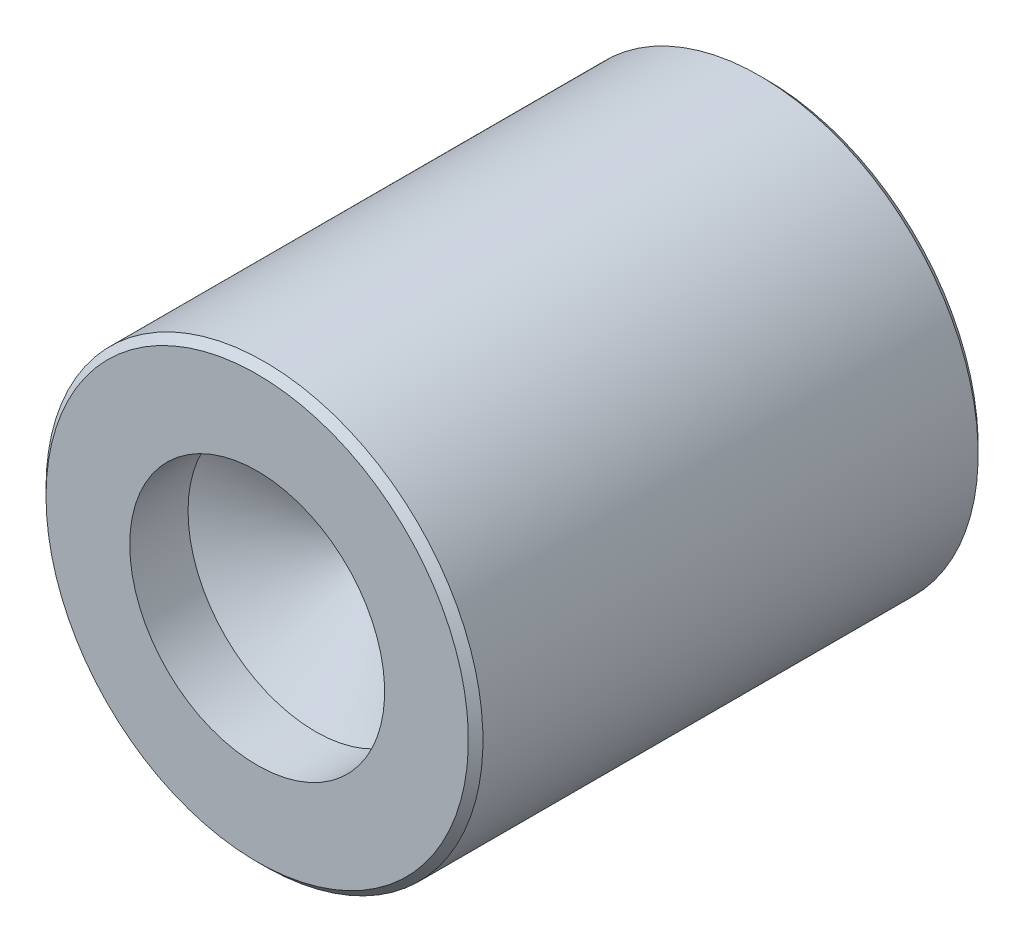
ISO-10303-21;
HEADER;
FILE_DESCRIPTION(('STEP AP214'),'2;1');
FILE_NAME('part.step','',(''),(''),'','','');
FILE_SCHEMA(('AUTOMOTIVE_DESIGN { 1 0 10303 214 1 1 1 1 }'));
ENDSEC;
DATA;
#1=APPLICATION_CONTEXT('core data for automotive mechanical design processes');
#2=APPLICATION_PROTOCOL_DEFINITION('international standard','automotive_design',2000,#1);
#3=PRODUCT_CONTEXT('',#1,'mechanical');
#4=PRODUCT('Part','Part','',(#3));
#5=PRODUCT_RELATED_PRODUCT_CATEGORY('part','',(#4));
#6=PRODUCT_DEFINITION_FORMATION('','',#4);
#7=PRODUCT_DEFINITION_CONTEXT('part definition',#1,'design');
#8=PRODUCT_DEFINITION('design','',#6,#7);
#9=PRODUCT_DEFINITION_SHAPE('','',#8);
#10=(LENGTH_UNIT() NAMED_UNIT(*) SI_UNIT(.MILLI.,.METRE.));
#11=(NAMED_UNIT(*) PLANE_ANGLE_UNIT() SI_UNIT($,.RADIAN.));
#12=(NAMED_UNIT(*) SI_UNIT($,.STERADIAN.) SOLID_ANGLE_UNIT());
#13=UNCERTAINTY_MEASURE_WITH_UNIT(LENGTH_MEASURE(1.E-05),#10,'distance_accuracy_value','');
#14=(GEOMETRIC_REPRESENTATION_CONTEXT(3) GLOBAL_UNCERTAINTY_ASSIGNED_CONTEXT((#13)) GLOBAL_UNIT_ASSIGNED_CONTEXT((#10,
#11,#12)) REPRESENTATION_CONTEXT('',''));
#15=CARTESIAN_POINT('',(0.,0.,0.));
#16=DIRECTION('',(0.,0.,1.));
#17=DIRECTION('',(1.,0.,0.));
#18=AXIS2_PLACEMENT_3D('',#15,#16,#17);
#19=CARTESIAN_POINT('',(0.,0.,70.));
#20=DIRECTION('',(0.,0.,-1.));
#21=DIRECTION('',(-1.,0.,0.));
#22=AXIS2_PLACEMENT_3D('',#19,#20,#21);
#23=CYLINDRICAL_SURFACE('',#22,17.5);
#24=CARTESIAN_POINT('',(0.,0.,62.));
#25=DIRECTION('',(0.,0.,-1.));
#26=DIRECTION('',(-1.,0.,0.));
#27=AXIS2_PLACEMENT_3D('',#24,#25,#26);
#28=CIRCLE('',#27,17.5);
#29=CARTESIAN_POINT('',(-17.5,0.,62.));
#30=VERTEX_POINT('',#29);
#31=EDGE_CURVE('E11',#30,#30,#28,.T.);
#32=ORIENTED_EDGE('',*,*,#31,.T.);
#33=EDGE_LOOP('',(#32));
#34=FACE_BOUND('',#33,.T.);
#35=CARTESIAN_POINT('',(0.,0.,70.));
#36=DIRECTION('',(0.,0.,-1.));
#37=DIRECTION('',(-1.,0.,0.));
#38=AXIS2_PLACEMENT_3D('',#35,#36,#37);
#39=CIRCLE('',#38,17.5);
#40=CARTESIAN_POINT('',(-17.5,0.,70.));
#41=VERTEX_POINT('',#40);
#42=EDGE_CURVE('E52',#41,#41,#39,.T.);
#43=ORIENTED_EDGE('',*,*,#42,.F.);
#44=EDGE_LOOP('',(#43));
#45=FACE_BOUND('',#44,.T.);
#46=ADVANCED_FACE('F33',(#34,#45),#23,.F.);
#47=CARTESIAN_POINT('',(0.,0.,62.));
#48=DIRECTION('',(0.,0.,1.));
#49=DIRECTION('',(1.,0.,0.));
#50=AXIS2_PLACEMENT_3D('',#47,#48,#49);
#51=CONICAL_SURFACE('',#50,17.5,1.02974425867665);
#52=CARTESIAN_POINT('',(0.,0.,51.4849391670177));
#53=VERTEX_POINT('',#52);
#54=VERTEX_LOOP('',#53);
#55=FACE_BOUND('',#54,.T.);
#56=ORIENTED_EDGE('',*,*,#31,.F.);
#57=EDGE_LOOP('',(#56));
#58=FACE_BOUND('',#57,.T.);
#59=ADVANCED_FACE('F42',(#55,#58),#51,.F.);
#60=CARTESIAN_POINT('',(0.,0.,0.));
#61=DIRECTION('',(0.,0.,-1.));
#62=DIRECTION('',(-1.,0.,0.));
#63=AXIS2_PLACEMENT_3D('',#60,#61,#62);
#64=PLANE('',#63);
#65=CARTESIAN_POINT('',(0.,0.,0.));
#66=DIRECTION('',(0.,0.,-1.));
#67=DIRECTION('',(-1.,0.,0.));
#68=AXIS2_PLACEMENT_3D('',#65,#66,#67);
#69=CIRCLE('',#68,29.);
#70=CARTESIAN_POINT('',(-29.,0.,0.));
#71=VERTEX_POINT('',#70);
#72=EDGE_CURVE('E39',#71,#71,#69,.T.);
#73=ORIENTED_EDGE('',*,*,#72,.T.);
#74=EDGE_LOOP('',(#73));
#75=FACE_BOUND('',#74,.T.);
#76=ADVANCED_FACE('F45',(#75),#64,.T.);
#77=CARTESIAN_POINT('',(0.,0.,0.));
#78=DIRECTION('',(0.,0.,1.));
#79=DIRECTION('',(1.,0.,0.));
#80=AXIS2_PLACEMENT_3D('',#77,#78,#79);
#81=CONICAL_SURFACE('',#80,29.,0.785398163397447);
#82=CARTESIAN_POINT('',(0.,0.,1.));
#83=DIRECTION('',(0.,0.,-1.));
#84=DIRECTION('',(-1.,0.,0.));
#85=AXIS2_PLACEMENT_3D('',#82,#83,#84);
#86=CIRCLE('',#85,30.);
#87=CARTESIAN_POINT('',(-30.,0.,1.));
#88=VERTEX_POINT('',#87);
#89=EDGE_CURVE('E62',#88,#88,#86,.T.);
#90=ORIENTED_EDGE('',*,*,#89,.T.);
#91=EDGE_LOOP('',(#90));
#92=FACE_BOUND('',#91,.T.);
#93=ORIENTED_EDGE('',*,*,#72,.F.);
#94=EDGE_LOOP('',(#93));
#95=FACE_BOUND('',#94,.T.);
#96=ADVANCED_FACE('F68',(#92,#95),#81,.T.);
#97=CARTESIAN_POINT('',(0.,0.,70.));
#98=DIRECTION('',(0.,0.,-1.));
#99=DIRECTION('',(-1.,0.,0.));
#100=AXIS2_PLACEMENT_3D('',#97,#98,#99);
#101=CYLINDRICAL_SURFACE('',#100,30.);
#102=CARTESIAN_POINT('',(0.,0.,69.));
#103=DIRECTION('',(0.,0.,-1.));
#104=DIRECTION('',(-1.,0.,0.));
#105=AXIS2_PLACEMENT_3D('',#102,#103,#104);
#106=CIRCLE('',#105,30.);
#107=CARTESIAN_POINT('',(-30.,0.,69.));
#108=VERTEX_POINT('',#107);
#109=EDGE_CURVE('E57',#108,#108,#106,.T.);
#110=ORIENTED_EDGE('',*,*,#109,.T.);
#111=EDGE_LOOP('',(#110));
#112=FACE_BOUND('',#111,.T.);
#113=ORIENTED_EDGE('',*,*,#89,.F.);
#114=EDGE_LOOP('',(#113));
#115=FACE_BOUND('',#114,.T.);
#116=ADVANCED_FACE('F70',(#112,#115),#101,.T.);
#117=CARTESIAN_POINT('',(0.,0.,69.));
#118=DIRECTION('',(0.,0.,-1.));
#119=DIRECTION('',(-1.,0.,0.));
#120=AXIS2_PLACEMENT_3D('',#117,#118,#119);
#121=CONICAL_SURFACE('',#120,30.,0.785398163397448);
#122=CARTESIAN_POINT('',(0.,0.,70.));
#123=DIRECTION('',(0.,0.,-1.));
#124=DIRECTION('',(-1.,0.,0.));
#125=AXIS2_PLACEMENT_3D('',#122,#123,#124);
#126=CIRCLE('',#125,29.);
#127=CARTESIAN_POINT('',(-29.,0.,70.));
#128=VERTEX_POINT('',#127);
#129=EDGE_CURVE('E54',#128,#128,#126,.T.);
#130=ORIENTED_EDGE('',*,*,#129,.T.);
#131=EDGE_LOOP('',(#130));
#132=FACE_BOUND('',#131,.T.);
#133=ORIENTED_EDGE('',*,*,#109,.F.);
#134=EDGE_LOOP('',(#133));
#135=FACE_BOUND('',#134,.T.);
#136=ADVANCED_FACE('F77',(#132,#135),#121,.T.);
#137=CARTESIAN_POINT('',(29.,0.,70.));
#138=DIRECTION('',(0.,0.,1.));
#139=DIRECTION('',(1.,0.,0.));
#140=AXIS2_PLACEMENT_3D('',#137,#138,#139);
#141=PLANE('',#140);
#142=ORIENTED_EDGE('',*,*,#42,.T.);
#143=EDGE_LOOP('',(#142));
#144=FACE_BOUND('',#143,.T.);
#145=ORIENTED_EDGE('',*,*,#129,.F.);
#146=EDGE_LOOP('',(#145));
#147=FACE_BOUND('',#146,.T.);
#148=ADVANCED_FACE('F84',(#144,#147),#141,.T.);
#149=CLOSED_SHELL('',(#46,#59,#76,#96,#116,#136,#148));
#150=MANIFOLD_SOLID_BREP('B2',#149);
#151=ADVANCED_BREP_SHAPE_REPRESENTATION('',(#18,#150),#14);
#152=SHAPE_DEFINITION_REPRESENTATION(#9,#151);
ENDSEC;
END-ISO-10303-21;
